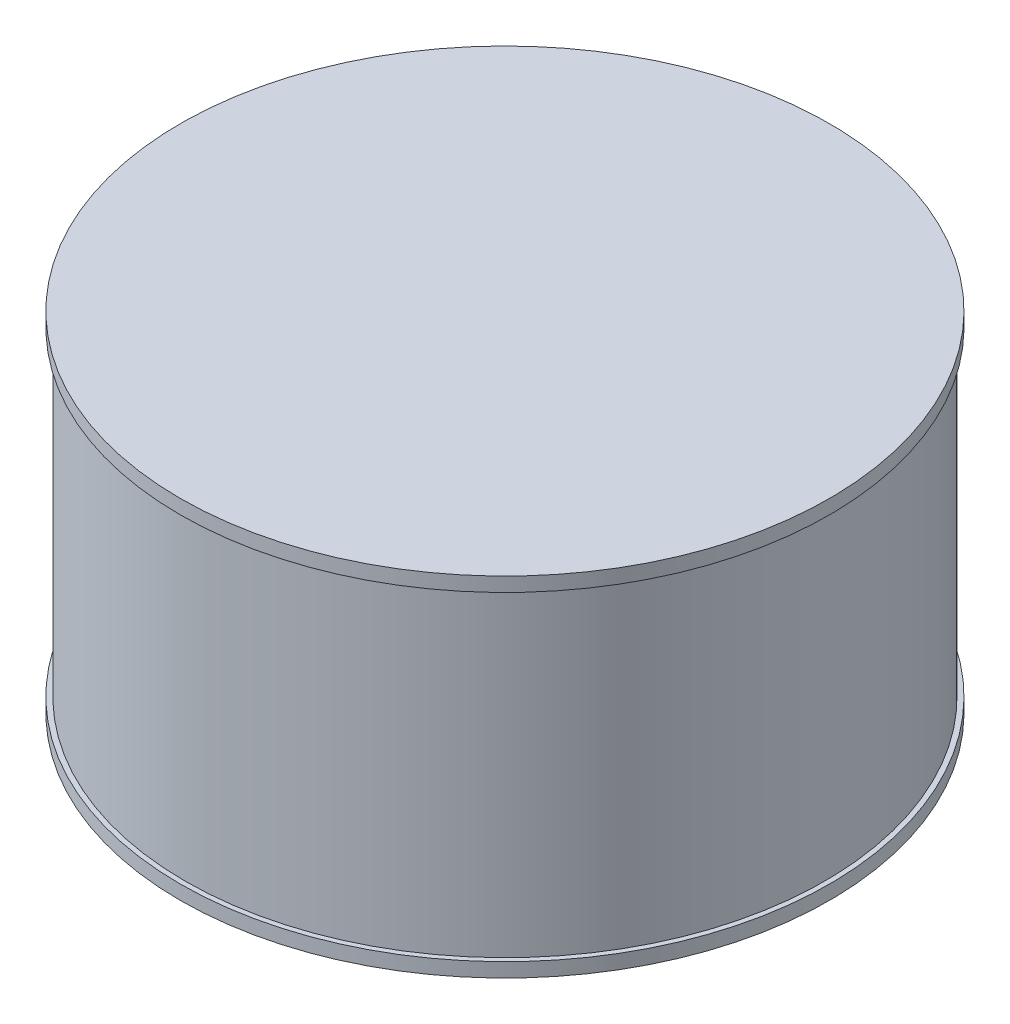
ISO-10303-21;
HEADER;
FILE_DESCRIPTION(('STEP AP214'),'2;1');
FILE_NAME('part.step','',(''),(''),'','','');
FILE_SCHEMA(('AUTOMOTIVE_DESIGN { 1 0 10303 214 1 1 1 1 }'));
ENDSEC;
DATA;
#1=APPLICATION_CONTEXT('core data for automotive mechanical design processes');
#2=APPLICATION_PROTOCOL_DEFINITION('international standard','automotive_design',2000,#1);
#3=PRODUCT_CONTEXT('',#1,'mechanical');
#4=PRODUCT('Part','Part','',(#3));
#5=PRODUCT_RELATED_PRODUCT_CATEGORY('part','',(#4));
#6=PRODUCT_DEFINITION_FORMATION('','',#4);
#7=PRODUCT_DEFINITION_CONTEXT('part definition',#1,'design');
#8=PRODUCT_DEFINITION('design','',#6,#7);
#9=PRODUCT_DEFINITION_SHAPE('','',#8);
#10=(LENGTH_UNIT() NAMED_UNIT(*) SI_UNIT(.MILLI.,.METRE.));
#11=(NAMED_UNIT(*) PLANE_ANGLE_UNIT() SI_UNIT($,.RADIAN.));
#12=(NAMED_UNIT(*) SI_UNIT($,.STERADIAN.) SOLID_ANGLE_UNIT());
#13=UNCERTAINTY_MEASURE_WITH_UNIT(LENGTH_MEASURE(1.E-05),#10,'distance_accuracy_value','');
#14=(GEOMETRIC_REPRESENTATION_CONTEXT(3) GLOBAL_UNCERTAINTY_ASSIGNED_CONTEXT((#13)) GLOBAL_UNIT_ASSIGNED_CONTEXT((#10,
#11,#12)) REPRESENTATION_CONTEXT('',''));
#15=CARTESIAN_POINT('',(0.,0.,0.));
#16=DIRECTION('',(0.,0.,1.));
#17=DIRECTION('',(1.,0.,0.));
#18=AXIS2_PLACEMENT_3D('',#15,#16,#17);
#19=CARTESIAN_POINT('',(0.,22.5,0.));
#20=DIRECTION('',(0.,-1.,0.));
#21=DIRECTION('',(0.,0.,-1.));
#22=AXIS2_PLACEMENT_3D('',#19,#20,#21);
#23=CYLINDRICAL_SURFACE('',#22,45.);
#24=CARTESIAN_POINT('',(0.,22.5,0.));
#25=DIRECTION('',(0.,1.,0.));
#26=DIRECTION('',(0.,0.,1.));
#27=AXIS2_PLACEMENT_3D('',#24,#25,#26);
#28=CIRCLE('',#27,45.);
#29=CARTESIAN_POINT('',(0.,22.5,-45.));
#30=VERTEX_POINT('',#29);
#31=EDGE_CURVE('E10',#30,#30,#28,.T.);
#32=CARTESIAN_POINT('',(0.,-22.5,0.));
#33=DIRECTION('',(0.,1.,0.));
#34=DIRECTION('',(0.,0.,1.));
#35=AXIS2_PLACEMENT_3D('',#32,#33,#34);
#36=CIRCLE('',#35,45.);
#37=CARTESIAN_POINT('',(0.,-22.5,-45.));
#38=VERTEX_POINT('',#37);
#39=EDGE_CURVE('E40',#38,#38,#36,.T.);
#40=CARTESIAN_POINT('',(0.,22.5,-45.));
#41=CARTESIAN_POINT('',(0.,22.03125,-45.));
#42=CARTESIAN_POINT('',(0.,21.5625,-45.));
#43=CARTESIAN_POINT('',(0.,20.625,-45.));
#44=CARTESIAN_POINT('',(0.,20.15625,-45.));
#45=CARTESIAN_POINT('',(0.,19.21875,-45.));
#46=CARTESIAN_POINT('',(0.,18.75,-45.));
#47=CARTESIAN_POINT('',(0.,17.8125,-45.));
#48=CARTESIAN_POINT('',(0.,17.34375,-45.));
#49=CARTESIAN_POINT('',(0.,16.40625,-45.));
#50=CARTESIAN_POINT('',(0.,15.9375,-45.));
#51=CARTESIAN_POINT('',(0.,15.,-45.));
#52=CARTESIAN_POINT('',(0.,14.53125,-45.));
#53=CARTESIAN_POINT('',(0.,13.59375,-45.));
#54=CARTESIAN_POINT('',(0.,13.125,-45.));
#55=CARTESIAN_POINT('',(0.,12.1875,-45.));
#56=CARTESIAN_POINT('',(0.,11.71875,-45.));
#57=CARTESIAN_POINT('',(0.,10.78125,-45.));
#58=CARTESIAN_POINT('',(0.,10.3125,-45.));
#59=CARTESIAN_POINT('',(0.,9.37499999999999,-45.));
#60=CARTESIAN_POINT('',(0.,8.90625,-45.));
#61=CARTESIAN_POINT('',(0.,7.96874999999999,-45.));
#62=CARTESIAN_POINT('',(0.,7.5,-45.));
#63=CARTESIAN_POINT('',(0.,6.5625,-45.));
#64=CARTESIAN_POINT('',(0.,6.09375,-45.));
#65=CARTESIAN_POINT('',(0.,5.15625,-45.));
#66=CARTESIAN_POINT('',(0.,4.6875,-45.));
#67=CARTESIAN_POINT('',(0.,3.75,-45.));
#68=CARTESIAN_POINT('',(0.,3.28125,-45.));
#69=CARTESIAN_POINT('',(0.,2.34375,-45.));
#70=CARTESIAN_POINT('',(0.,1.875,-45.));
#71=CARTESIAN_POINT('',(0.,0.937499999999997,-45.));
#72=CARTESIAN_POINT('',(0.,0.468749999999997,-45.));
#73=CARTESIAN_POINT('',(0.,-0.468750000000004,-45.));
#74=CARTESIAN_POINT('',(0.,-0.937500000000004,-45.));
#75=CARTESIAN_POINT('',(0.,-1.87500000000001,-45.));
#76=CARTESIAN_POINT('',(0.,-2.34375000000001,-45.));
#77=CARTESIAN_POINT('',(0.,-3.28125,-45.));
#78=CARTESIAN_POINT('',(0.,-3.75,-45.));
#79=CARTESIAN_POINT('',(0.,-4.6875,-45.));
#80=CARTESIAN_POINT('',(0.,-5.15625,-45.));
#81=CARTESIAN_POINT('',(0.,-6.09375000000001,-45.));
#82=CARTESIAN_POINT('',(0.,-6.56250000000001,-45.));
#83=CARTESIAN_POINT('',(0.,-7.50000000000001,-45.));
#84=CARTESIAN_POINT('',(0.,-7.96875000000001,-45.));
#85=CARTESIAN_POINT('',(0.,-8.90625,-45.));
#86=CARTESIAN_POINT('',(0.,-9.37500000000001,-45.));
#87=CARTESIAN_POINT('',(0.,-10.3125,-45.));
#88=CARTESIAN_POINT('',(0.,-10.78125,-45.));
#89=CARTESIAN_POINT('',(0.,-11.71875,-45.));
#90=CARTESIAN_POINT('',(0.,-12.1875,-45.));
#91=CARTESIAN_POINT('',(0.,-13.125,-45.));
#92=CARTESIAN_POINT('',(0.,-13.59375,-45.));
#93=CARTESIAN_POINT('',(0.,-14.53125,-45.));
#94=CARTESIAN_POINT('',(0.,-15.,-45.));
#95=CARTESIAN_POINT('',(0.,-15.9375,-45.));
#96=CARTESIAN_POINT('',(0.,-16.40625,-45.));
#97=CARTESIAN_POINT('',(0.,-17.34375,-45.));
#98=CARTESIAN_POINT('',(0.,-17.8125,-45.));
#99=CARTESIAN_POINT('',(0.,-18.75,-45.));
#100=CARTESIAN_POINT('',(0.,-19.21875,-45.));
#101=CARTESIAN_POINT('',(0.,-20.15625,-45.));
#102=CARTESIAN_POINT('',(0.,-20.625,-45.));
#103=CARTESIAN_POINT('',(0.,-21.5625,-45.));
#104=CARTESIAN_POINT('',(0.,-22.03125,-45.));
#105=CARTESIAN_POINT('',(0.,-22.5,-45.));
#106=B_SPLINE_CURVE_WITH_KNOTS('',3,(#40,#41,#42,#43,#44,#45,#46,#47,#48,#49,#50,#51,#52,#53,
#54,#55,#56,#57,#58,#59,#60,#61,#62,#63,#64,#65,#66,#67,#68,#69,#70,#71,#72,#73,#74,#75,#76,#77,
#78,#79,#80,#81,#82,#83,#84,#85,#86,#87,#88,#89,#90,#91,#92,#93,#94,#95,#96,#97,#98,#99,#100,
#101,#102,#103,#104,#105),.UNSPECIFIED.,.F.,.F.,(4,2,2,2,2,2,2,2,2,2,2,2,2,2,2,2,2,2,2,2,2,2,2,
2,2,2,2,2,2,2,2,2,4),(0.,1.40625,2.8125,4.21875,5.625,7.03125,8.4375,9.84375,11.25,12.65625,
14.0625,15.46875,16.875,18.28125,19.6875,21.09375,22.5,23.90625,25.3125,26.71875,28.125,
29.53125,30.9375,32.34375,33.75,35.15625,36.5625,37.96875,39.375,40.78125,42.1875,43.59375,45.),.UNSPECIFIED.);
#107=EDGE_CURVE('BSEAM37',#30,#38,#106,.T.);
#108=ORIENTED_EDGE('',*,*,#31,.F.);
#109=ORIENTED_EDGE('',*,*,#39,.T.);
#110=ORIENTED_EDGE('',*,*,#107,.T.);
#111=ORIENTED_EDGE('',*,*,#107,.F.);
#112=EDGE_LOOP('',(#108,#110,#109,#111));
#113=FACE_BOUND('',#112,.T.);
#114=ADVANCED_FACE('F37',(#113),#23,.T.);
#115=CARTESIAN_POINT('',(0.,24.5,0.));
#116=DIRECTION('',(0.,-1.,0.));
#117=DIRECTION('',(0.,0.,-1.));
#118=AXIS2_PLACEMENT_3D('',#115,#116,#117);
#119=CYLINDRICAL_SURFACE('',#118,45.69);
#120=CARTESIAN_POINT('',(0.,24.5,0.));
#121=DIRECTION('',(0.,1.,0.));
#122=DIRECTION('',(0.,0.,1.));
#123=AXIS2_PLACEMENT_3D('',#120,#121,#122);
#124=CIRCLE('',#123,45.69);
#125=CARTESIAN_POINT('',(0.,24.5,45.69));
#126=VERTEX_POINT('',#125);
#127=EDGE_CURVE('E44',#126,#126,#124,.T.);
#128=ORIENTED_EDGE('',*,*,#127,.F.);
#129=EDGE_LOOP('',(#128));
#130=FACE_BOUND('',#129,.T.);
#131=CARTESIAN_POINT('',(0.,22.5,0.));
#132=DIRECTION('',(0.,1.,0.));
#133=DIRECTION('',(0.,0.,1.));
#134=AXIS2_PLACEMENT_3D('',#131,#132,#133);
#135=CIRCLE('',#134,45.69);
#136=CARTESIAN_POINT('',(0.,22.5,45.69));
#137=VERTEX_POINT('',#136);
#138=EDGE_CURVE('E48',#137,#137,#135,.T.);
#139=ORIENTED_EDGE('',*,*,#138,.T.);
#140=EDGE_LOOP('',(#139));
#141=FACE_BOUND('',#140,.T.);
#142=ADVANCED_FACE('F85',(#130,#141),#119,.T.);
#143=CARTESIAN_POINT('',(0.,24.5,0.));
#144=DIRECTION('',(0.,1.,0.));
#145=DIRECTION('',(0.,0.,1.));
#146=AXIS2_PLACEMENT_3D('',#143,#144,#145);
#147=PLANE('',#146);
#148=ORIENTED_EDGE('',*,*,#127,.T.);
#149=EDGE_LOOP('',(#148));
#150=FACE_BOUND('',#149,.T.);
#151=ADVANCED_FACE('F81',(#150),#147,.T.);
#152=CARTESIAN_POINT('',(0.,22.5,0.));
#153=DIRECTION('',(0.,1.,0.));
#154=DIRECTION('',(0.,0.,1.));
#155=AXIS2_PLACEMENT_3D('',#152,#153,#154);
#156=PLANE('',#155);
#157=ORIENTED_EDGE('',*,*,#31,.T.);
#158=EDGE_LOOP('',(#157));
#159=FACE_BOUND('',#158,.T.);
#160=ORIENTED_EDGE('',*,*,#138,.F.);
#161=EDGE_LOOP('',(#160));
#162=FACE_BOUND('',#161,.T.);
#163=ADVANCED_FACE('F73',(#159,#162),#156,.F.);
#164=CARTESIAN_POINT('',(0.,-24.5,0.));
#165=DIRECTION('',(0.,1.,0.));
#166=DIRECTION('',(0.,0.,1.));
#167=AXIS2_PLACEMENT_3D('',#164,#165,#166);
#168=CYLINDRICAL_SURFACE('',#167,45.69);
#169=CARTESIAN_POINT('',(0.,-24.5,0.));
#170=DIRECTION('',(0.,1.,0.));
#171=DIRECTION('',(0.,0.,1.));
#172=AXIS2_PLACEMENT_3D('',#169,#170,#171);
#173=CIRCLE('',#172,45.69);
#174=CARTESIAN_POINT('',(0.,-24.5,45.69));
#175=VERTEX_POINT('',#174);
#176=EDGE_CURVE('E56',#175,#175,#173,.T.);
#177=ORIENTED_EDGE('',*,*,#176,.T.);
#178=EDGE_LOOP('',(#177));
#179=FACE_BOUND('',#178,.T.);
#180=CARTESIAN_POINT('',(0.,-22.5,0.));
#181=DIRECTION('',(0.,1.,0.));
#182=DIRECTION('',(0.,0.,1.));
#183=AXIS2_PLACEMENT_3D('',#180,#181,#182);
#184=CIRCLE('',#183,45.69);
#185=CARTESIAN_POINT('',(0.,-22.5,45.69));
#186=VERTEX_POINT('',#185);
#187=EDGE_CURVE('E53',#186,#186,#184,.T.);
#188=ORIENTED_EDGE('',*,*,#187,.F.);
#189=EDGE_LOOP('',(#188));
#190=FACE_BOUND('',#189,.T.);
#191=ADVANCED_FACE('F71',(#179,#190),#168,.T.);
#192=CARTESIAN_POINT('',(0.,-24.5,0.));
#193=DIRECTION('',(0.,-1.,0.));
#194=DIRECTION('',(0.,0.,1.));
#195=AXIS2_PLACEMENT_3D('',#192,#193,#194);
#196=PLANE('',#195);
#197=ORIENTED_EDGE('',*,*,#176,.F.);
#198=EDGE_LOOP('',(#197));
#199=FACE_BOUND('',#198,.T.);
#200=ADVANCED_FACE('F67',(#199),#196,.T.);
#201=CARTESIAN_POINT('',(0.,-22.5,0.));
#202=DIRECTION('',(0.,-1.,0.));
#203=DIRECTION('',(0.,0.,1.));
#204=AXIS2_PLACEMENT_3D('',#201,#202,#203);
#205=PLANE('',#204);
#206=ORIENTED_EDGE('',*,*,#39,.F.);
#207=EDGE_LOOP('',(#206));
#208=FACE_BOUND('',#207,.T.);
#209=ORIENTED_EDGE('',*,*,#187,.T.);
#210=EDGE_LOOP('',(#209));
#211=FACE_BOUND('',#210,.T.);
#212=ADVANCED_FACE('F64',(#208,#211),#205,.F.);
#213=CLOSED_SHELL('',(#114,#142,#151,#163,#191,#200,#212));
#214=MANIFOLD_SOLID_BREP('B2',#213);
#215=ADVANCED_BREP_SHAPE_REPRESENTATION('',(#18,#214),#14);
#216=SHAPE_DEFINITION_REPRESENTATION(#9,#215);
ENDSEC;
END-ISO-10303-21;
